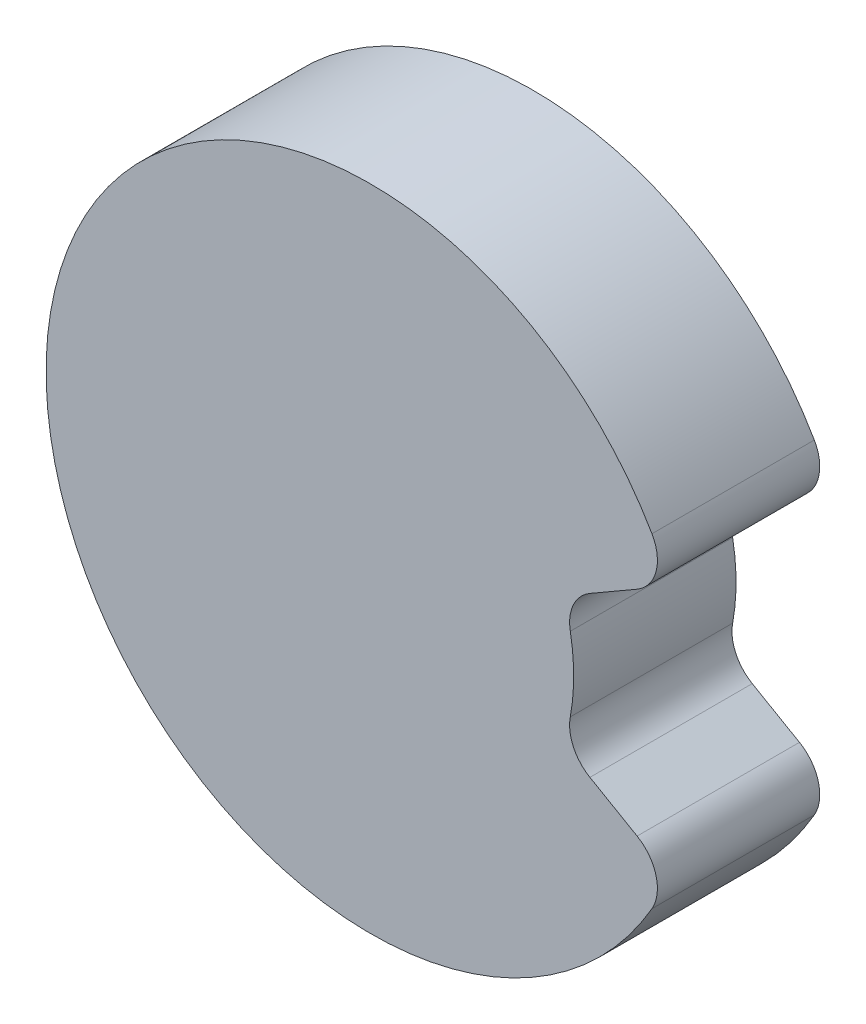
ISO-10303-21;
HEADER;
FILE_DESCRIPTION(('STEP AP214'),'2;1');
FILE_NAME('part.step','',(''),(''),'','','');
FILE_SCHEMA(('AUTOMOTIVE_DESIGN { 1 0 10303 214 1 1 1 1 }'));
ENDSEC;
DATA;
#1=APPLICATION_CONTEXT('core data for automotive mechanical design processes');
#2=APPLICATION_PROTOCOL_DEFINITION('international standard','automotive_design',2000,#1);
#3=PRODUCT_CONTEXT('',#1,'mechanical');
#4=PRODUCT('Part','Part','',(#3));
#5=PRODUCT_RELATED_PRODUCT_CATEGORY('part','',(#4));
#6=PRODUCT_DEFINITION_FORMATION('','',#4);
#7=PRODUCT_DEFINITION_CONTEXT('part definition',#1,'design');
#8=PRODUCT_DEFINITION('design','',#6,#7);
#9=PRODUCT_DEFINITION_SHAPE('','',#8);
#10=(LENGTH_UNIT() NAMED_UNIT(*) SI_UNIT(.MILLI.,.METRE.));
#11=(NAMED_UNIT(*) PLANE_ANGLE_UNIT() SI_UNIT($,.RADIAN.));
#12=(NAMED_UNIT(*) SI_UNIT($,.STERADIAN.) SOLID_ANGLE_UNIT());
#13=UNCERTAINTY_MEASURE_WITH_UNIT(LENGTH_MEASURE(1.E-05),#10,'distance_accuracy_value','');
#14=(GEOMETRIC_REPRESENTATION_CONTEXT(3) GLOBAL_UNCERTAINTY_ASSIGNED_CONTEXT((#13)) GLOBAL_UNIT_ASSIGNED_CONTEXT((#10,
#11,#12)) REPRESENTATION_CONTEXT('',''));
#15=CARTESIAN_POINT('',(0.,0.,0.));
#16=DIRECTION('',(0.,0.,1.));
#17=DIRECTION('',(1.,0.,0.));
#18=AXIS2_PLACEMENT_3D('',#15,#16,#17);
#19=CARTESIAN_POINT('',(0.,0.,25.4));
#20=DIRECTION('',(0.,0.,-1.));
#21=DIRECTION('',(-1.,0.,0.));
#22=AXIS2_PLACEMENT_3D('',#19,#20,#21);
#23=CYLINDRICAL_SURFACE('',#22,63.5);
#24=CARTESIAN_POINT('',(0.,0.,-25.4));
#25=DIRECTION('',(0.,0.,1.));
#26=DIRECTION('',(1.,0.,0.));
#27=AXIS2_PLACEMENT_3D('',#24,#25,#26);
#28=CIRCLE('',#27,63.5);
#29=CARTESIAN_POINT('',(62.4308662222439,-11.60331602346,-25.4));
#30=VERTEX_POINT('',#29);
#31=CARTESIAN_POINT('',(62.4308662222439,11.60331602346,-25.4));
#32=VERTEX_POINT('',#31);
#33=EDGE_CURVE('E146',#30,#32,#28,.T.);
#34=ORIENTED_EDGE('',*,*,#33,.T.);
#35=DIRECTION('',(0.,0.,-1.));
#36=VECTOR('',#35,1.);
#37=CARTESIAN_POINT('',(62.4308662222439,11.60331602346,25.4));
#38=LINE('',#37,#36);
#39=CARTESIAN_POINT('',(62.4308662222439,11.60331602346,25.4));
#40=VERTEX_POINT('',#39);
#41=EDGE_CURVE('E169',#32,#40,#38,.F.);
#42=ORIENTED_EDGE('',*,*,#41,.T.);
#43=CARTESIAN_POINT('',(0.,0.,25.4));
#44=DIRECTION('',(0.,0.,1.));
#45=DIRECTION('',(1.,0.,0.));
#46=AXIS2_PLACEMENT_3D('',#43,#44,#45);
#47=CIRCLE('',#46,63.5);
#48=CARTESIAN_POINT('',(62.4308662222439,-11.60331602346,25.4));
#49=VERTEX_POINT('',#48);
#50=EDGE_CURVE('E144',#49,#40,#47,.T.);
#51=ORIENTED_EDGE('',*,*,#50,.F.);
#52=DIRECTION('',(0.,0.,-1.));
#53=VECTOR('',#52,1.);
#54=CARTESIAN_POINT('',(62.4308662222439,-11.60331602346,25.4));
#55=LINE('',#54,#53);
#56=EDGE_CURVE('E165',#49,#30,#55,.T.);
#57=ORIENTED_EDGE('',*,*,#56,.T.);
#58=EDGE_LOOP('',(#34,#42,#51,#57));
#59=FACE_BOUND('',#58,.T.);
#60=ADVANCED_FACE('F45',(#59),#23,.T.);
#61=CARTESIAN_POINT('',(93.6480669889087,39.4030398477182,25.4));
#62=DIRECTION('',(-0.500000000000001,0.866025403784438,0.));
#63=DIRECTION('',(-0.866025403784438,-0.500000000000001,0.));
#64=AXIS2_PLACEMENT_3D('',#61,#62,#63);
#65=PLANE('',#64);
#66=DIRECTION('',(0.866025403784438,0.500000000000001,0.));
#67=VECTOR('',#66,1.);
#68=CARTESIAN_POINT('',(93.6480669889087,39.4030398477182,-25.4));
#69=LINE('',#68,#67);
#70=CARTESIAN_POINT('',(68.5670394666927,24.9225018562144,-25.4));
#71=VERTEX_POINT('',#70);
#72=CARTESIAN_POINT('',(83.3396583964365,33.4514773719378,-25.4));
#73=VERTEX_POINT('',#72);
#74=EDGE_CURVE('E140',#71,#73,#69,.T.);
#75=ORIENTED_EDGE('',*,*,#74,.T.);
#76=DIRECTION('',(0.,0.,-1.));
#77=VECTOR('',#76,1.);
#78=CARTESIAN_POINT('',(83.3396583964365,33.4514773719378,25.4));
#79=LINE('',#78,#77);
#80=CARTESIAN_POINT('',(83.3396583964365,33.4514773719378,25.4));
#81=VERTEX_POINT('',#80);
#82=EDGE_CURVE('E117',#73,#81,#79,.F.);
#83=ORIENTED_EDGE('',*,*,#82,.T.);
#84=DIRECTION('',(0.866025403784438,0.500000000000001,0.));
#85=VECTOR('',#84,1.);
#86=CARTESIAN_POINT('',(93.6480669889087,39.4030398477182,25.4));
#87=LINE('',#86,#85);
#88=CARTESIAN_POINT('',(68.5670394666927,24.9225018562144,25.4));
#89=VERTEX_POINT('',#88);
#90=EDGE_CURVE('E199',#89,#81,#87,.T.);
#91=ORIENTED_EDGE('',*,*,#90,.F.);
#92=DIRECTION('',(0.,0.,1.));
#93=VECTOR('',#92,1.);
#94=CARTESIAN_POINT('',(68.5670394666927,24.9225018562144,-25.4));
#95=LINE('',#94,#93);
#96=EDGE_CURVE('E123',#89,#71,#95,.F.);
#97=ORIENTED_EDGE('',*,*,#96,.T.);
#98=EDGE_LOOP('',(#75,#83,#91,#97));
#99=FACE_BOUND('',#98,.T.);
#100=ADVANCED_FACE('F213',(#99),#65,.F.);
#101=CARTESIAN_POINT('',(0.,0.,25.4));
#102=DIRECTION('',(0.,0.,-1.));
#103=DIRECTION('',(-1.,0.,0.));
#104=AXIS2_PLACEMENT_3D('',#101,#102,#103);
#105=CYLINDRICAL_SURFACE('',#104,101.6);
#106=CARTESIAN_POINT('',(0.,0.,25.4));
#107=DIRECTION('',(0.,0.,1.));
#108=DIRECTION('',(1.,0.,0.));
#109=AXIS2_PLACEMENT_3D('',#106,#107,#108);
#110=CIRCLE('',#109,101.6);
#111=CARTESIAN_POINT('',(87.9881810244989,50.8000000000002,25.4));
#112=VERTEX_POINT('',#111);
#113=CARTESIAN_POINT('',(87.9881810244989,-50.8000000000001,25.4));
#114=VERTEX_POINT('',#113);
#115=EDGE_CURVE('E132',#112,#114,#110,.T.);
#116=ORIENTED_EDGE('',*,*,#115,.F.);
#117=DIRECTION('',(0.,0.,-1.));
#118=VECTOR('',#117,1.);
#119=CARTESIAN_POINT('',(87.9881810244989,50.8000000000002,25.4));
#120=LINE('',#119,#118);
#121=CARTESIAN_POINT('',(87.9881810244989,50.8000000000002,-25.4));
#122=VERTEX_POINT('',#121);
#123=EDGE_CURVE('E116',#112,#122,#120,.T.);
#124=ORIENTED_EDGE('',*,*,#123,.T.);
#125=CARTESIAN_POINT('',(0.,0.,-25.4));
#126=DIRECTION('',(0.,0.,1.));
#127=DIRECTION('',(1.,0.,0.));
#128=AXIS2_PLACEMENT_3D('',#125,#126,#127);
#129=CIRCLE('',#128,101.6);
#130=CARTESIAN_POINT('',(87.9881810244989,-50.8000000000001,-25.4));
#131=VERTEX_POINT('',#130);
#132=EDGE_CURVE('E130',#122,#131,#129,.T.);
#133=ORIENTED_EDGE('',*,*,#132,.T.);
#134=DIRECTION('',(0.,0.,-1.));
#135=VECTOR('',#134,1.);
#136=CARTESIAN_POINT('',(87.9881810244989,-50.8000000000001,25.4));
#137=LINE('',#136,#135);
#138=EDGE_CURVE('E134',#131,#114,#137,.F.);
#139=ORIENTED_EDGE('',*,*,#138,.T.);
#140=EDGE_LOOP('',(#116,#124,#133,#139));
#141=FACE_BOUND('',#140,.T.);
#142=ADVANCED_FACE('F129',(#141),#105,.T.);
#143=CARTESIAN_POINT('',(93.6480669889087,-39.4030398477182,25.4));
#144=DIRECTION('',(-0.500000000000001,-0.866025403784438,0.));
#145=DIRECTION('',(0.866025403784438,-0.500000000000001,0.));
#146=AXIS2_PLACEMENT_3D('',#143,#144,#145);
#147=PLANE('',#146);
#148=DIRECTION('',(-0.866025403784438,0.500000000000001,0.));
#149=VECTOR('',#148,1.);
#150=CARTESIAN_POINT('',(93.6480669889087,-39.4030398477182,25.4));
#151=LINE('',#150,#149);
#152=CARTESIAN_POINT('',(83.3396583964366,-33.4514773719377,25.4));
#153=VERTEX_POINT('',#152);
#154=CARTESIAN_POINT('',(68.5670394666927,-24.9225018562144,25.4));
#155=VERTEX_POINT('',#154);
#156=EDGE_CURVE('E151',#153,#155,#151,.T.);
#157=ORIENTED_EDGE('',*,*,#156,.F.);
#158=DIRECTION('',(0.,0.,-1.));
#159=VECTOR('',#158,1.);
#160=CARTESIAN_POINT('',(83.3396583964366,-33.4514773719377,25.4));
#161=LINE('',#160,#159);
#162=CARTESIAN_POINT('',(83.3396583964366,-33.4514773719377,-25.4));
#163=VERTEX_POINT('',#162);
#164=EDGE_CURVE('E174',#153,#163,#161,.T.);
#165=ORIENTED_EDGE('',*,*,#164,.T.);
#166=DIRECTION('',(-0.866025403784438,0.500000000000001,0.));
#167=VECTOR('',#166,1.);
#168=CARTESIAN_POINT('',(93.6480669889087,-39.4030398477182,-25.4));
#169=LINE('',#168,#167);
#170=CARTESIAN_POINT('',(68.5670394666927,-24.9225018562144,-25.4));
#171=VERTEX_POINT('',#170);
#172=EDGE_CURVE('E139',#163,#171,#169,.T.);
#173=ORIENTED_EDGE('',*,*,#172,.T.);
#174=DIRECTION('',(0.,0.,1.));
#175=VECTOR('',#174,1.);
#176=CARTESIAN_POINT('',(68.5670394666927,-24.9225018562144,25.4));
#177=LINE('',#176,#175);
#178=EDGE_CURVE('E61',#171,#155,#177,.T.);
#179=ORIENTED_EDGE('',*,*,#178,.T.);
#180=EDGE_LOOP('',(#157,#165,#173,#179));
#181=FACE_BOUND('',#180,.T.);
#182=ADVANCED_FACE('F188',(#181),#147,.F.);
#183=CARTESIAN_POINT('',(0.,0.,25.4));
#184=DIRECTION('',(0.,0.,1.));
#185=DIRECTION('',(1.,0.,0.));
#186=AXIS2_PLACEMENT_3D('',#183,#184,#185);
#187=PLANE('',#186);
#188=ORIENTED_EDGE('',*,*,#90,.T.);
#189=CARTESIAN_POINT('',(76.9896583964365,44.4500000000001,25.4));
#190=DIRECTION('',(0.,0.,1.));
#191=DIRECTION('',(1.,0.,0.));
#192=AXIS2_PLACEMENT_3D('',#189,#190,#191);
#193=CIRCLE('',#192,12.7);
#194=EDGE_CURVE('E162',#81,#112,#193,.T.);
#195=ORIENTED_EDGE('',*,*,#194,.T.);
#196=ORIENTED_EDGE('',*,*,#115,.T.);
#197=CARTESIAN_POINT('',(76.9896583964366,-44.4500000000001,25.4));
#198=DIRECTION('',(0.,0.,1.));
#199=DIRECTION('',(1.,0.,0.));
#200=AXIS2_PLACEMENT_3D('',#197,#198,#199);
#201=CIRCLE('',#200,12.7);
#202=EDGE_CURVE('E68',#114,#153,#201,.T.);
#203=ORIENTED_EDGE('',*,*,#202,.T.);
#204=ORIENTED_EDGE('',*,*,#156,.T.);
#205=CARTESIAN_POINT('',(74.9170394666927,-13.923979228152,25.4));
#206=DIRECTION('',(0.,0.,1.));
#207=DIRECTION('',(1.,0.,0.));
#208=AXIS2_PLACEMENT_3D('',#205,#206,#207);
#209=CIRCLE('',#208,12.7);
#210=EDGE_CURVE('E11',#155,#49,#209,.F.);
#211=ORIENTED_EDGE('',*,*,#210,.T.);
#212=ORIENTED_EDGE('',*,*,#50,.T.);
#213=CARTESIAN_POINT('',(74.9170394666927,13.923979228152,25.4));
#214=DIRECTION('',(0.,0.,1.));
#215=DIRECTION('',(1.,0.,0.));
#216=AXIS2_PLACEMENT_3D('',#213,#214,#215);
#217=CIRCLE('',#216,12.7);
#218=EDGE_CURVE('E181',#40,#89,#217,.F.);
#219=ORIENTED_EDGE('',*,*,#218,.T.);
#220=EDGE_LOOP('',(#188,#195,#196,#203,#204,#211,#212,#219));
#221=FACE_BOUND('',#220,.T.);
#222=ADVANCED_FACE('F194',(#221),#187,.T.);
#223=CARTESIAN_POINT('',(0.,0.,-25.4));
#224=DIRECTION('',(0.,0.,1.));
#225=DIRECTION('',(1.,0.,0.));
#226=AXIS2_PLACEMENT_3D('',#223,#224,#225);
#227=PLANE('',#226);
#228=ORIENTED_EDGE('',*,*,#132,.F.);
#229=CARTESIAN_POINT('',(76.9896583964365,44.4500000000001,-25.4));
#230=DIRECTION('',(0.,0.,1.));
#231=DIRECTION('',(1.,0.,0.));
#232=AXIS2_PLACEMENT_3D('',#229,#230,#231);
#233=CIRCLE('',#232,12.7);
#234=EDGE_CURVE('E112',#122,#73,#233,.F.);
#235=ORIENTED_EDGE('',*,*,#234,.T.);
#236=ORIENTED_EDGE('',*,*,#74,.F.);
#237=CARTESIAN_POINT('',(74.9170394666927,13.923979228152,-25.4));
#238=DIRECTION('',(0.,0.,1.));
#239=DIRECTION('',(1.,0.,0.));
#240=AXIS2_PLACEMENT_3D('',#237,#238,#239);
#241=CIRCLE('',#240,12.7);
#242=EDGE_CURVE('E178',#71,#32,#241,.T.);
#243=ORIENTED_EDGE('',*,*,#242,.T.);
#244=ORIENTED_EDGE('',*,*,#33,.F.);
#245=CARTESIAN_POINT('',(74.9170394666927,-13.923979228152,-25.4));
#246=DIRECTION('',(0.,0.,1.));
#247=DIRECTION('',(1.,0.,0.));
#248=AXIS2_PLACEMENT_3D('',#245,#246,#247);
#249=CIRCLE('',#248,12.7);
#250=EDGE_CURVE('E54',#30,#171,#249,.T.);
#251=ORIENTED_EDGE('',*,*,#250,.T.);
#252=ORIENTED_EDGE('',*,*,#172,.F.);
#253=CARTESIAN_POINT('',(76.9896583964366,-44.4500000000001,-25.4));
#254=DIRECTION('',(0.,0.,1.));
#255=DIRECTION('',(1.,0.,0.));
#256=AXIS2_PLACEMENT_3D('',#253,#254,#255);
#257=CIRCLE('',#256,12.7);
#258=EDGE_CURVE('E124',#163,#131,#257,.F.);
#259=ORIENTED_EDGE('',*,*,#258,.T.);
#260=EDGE_LOOP('',(#228,#235,#236,#243,#244,#251,#252,#259));
#261=FACE_BOUND('',#260,.T.);
#262=ADVANCED_FACE('F136',(#261),#227,.F.);
#263=CARTESIAN_POINT('',(76.9896583964365,44.4500000000001,25.4));
#264=DIRECTION('',(0.,0.,-1.));
#265=DIRECTION('',(-1.,0.,0.));
#266=AXIS2_PLACEMENT_3D('',#263,#264,#265);
#267=CYLINDRICAL_SURFACE('',#266,12.7);
#268=ORIENTED_EDGE('',*,*,#194,.F.);
#269=ORIENTED_EDGE('',*,*,#82,.F.);
#270=ORIENTED_EDGE('',*,*,#234,.F.);
#271=ORIENTED_EDGE('',*,*,#123,.F.);
#272=EDGE_LOOP('',(#268,#269,#270,#271));
#273=FACE_BOUND('',#272,.T.);
#274=ADVANCED_FACE('F115',(#273),#267,.T.);
#275=CARTESIAN_POINT('',(74.9170394666927,13.923979228152,25.4));
#276=DIRECTION('',(0.,0.,-1.));
#277=DIRECTION('',(-1.,0.,0.));
#278=AXIS2_PLACEMENT_3D('',#275,#276,#277);
#279=CYLINDRICAL_SURFACE('',#278,12.7);
#280=ORIENTED_EDGE('',*,*,#218,.F.);
#281=ORIENTED_EDGE('',*,*,#41,.F.);
#282=ORIENTED_EDGE('',*,*,#242,.F.);
#283=ORIENTED_EDGE('',*,*,#96,.F.);
#284=EDGE_LOOP('',(#280,#281,#282,#283));
#285=FACE_BOUND('',#284,.T.);
#286=ADVANCED_FACE('F209',(#285),#279,.F.);
#287=CARTESIAN_POINT('',(76.9896583964366,-44.4500000000001,25.4));
#288=DIRECTION('',(0.,0.,-1.));
#289=DIRECTION('',(-1.,0.,0.));
#290=AXIS2_PLACEMENT_3D('',#287,#288,#289);
#291=CYLINDRICAL_SURFACE('',#290,12.7);
#292=ORIENTED_EDGE('',*,*,#202,.F.);
#293=ORIENTED_EDGE('',*,*,#138,.F.);
#294=ORIENTED_EDGE('',*,*,#258,.F.);
#295=ORIENTED_EDGE('',*,*,#164,.F.);
#296=EDGE_LOOP('',(#292,#293,#294,#295));
#297=FACE_BOUND('',#296,.T.);
#298=ADVANCED_FACE('F227',(#297),#291,.T.);
#299=CARTESIAN_POINT('',(74.9170394666927,-13.923979228152,25.4));
#300=DIRECTION('',(0.,0.,-1.));
#301=DIRECTION('',(-1.,0.,0.));
#302=AXIS2_PLACEMENT_3D('',#299,#300,#301);
#303=CYLINDRICAL_SURFACE('',#302,12.7);
#304=ORIENTED_EDGE('',*,*,#210,.F.);
#305=ORIENTED_EDGE('',*,*,#178,.F.);
#306=ORIENTED_EDGE('',*,*,#250,.F.);
#307=ORIENTED_EDGE('',*,*,#56,.F.);
#308=EDGE_LOOP('',(#304,#305,#306,#307));
#309=FACE_BOUND('',#308,.T.);
#310=ADVANCED_FACE('F47',(#309),#303,.F.);
#311=CLOSED_SHELL('',(#60,#100,#142,#182,#222,#262,#274,#286,#298,#310));
#312=MANIFOLD_SOLID_BREP('B2',#311);
#313=ADVANCED_BREP_SHAPE_REPRESENTATION('',(#18,#312),#14);
#314=SHAPE_DEFINITION_REPRESENTATION(#9,#313);
ENDSEC;
END-ISO-10303-21;
